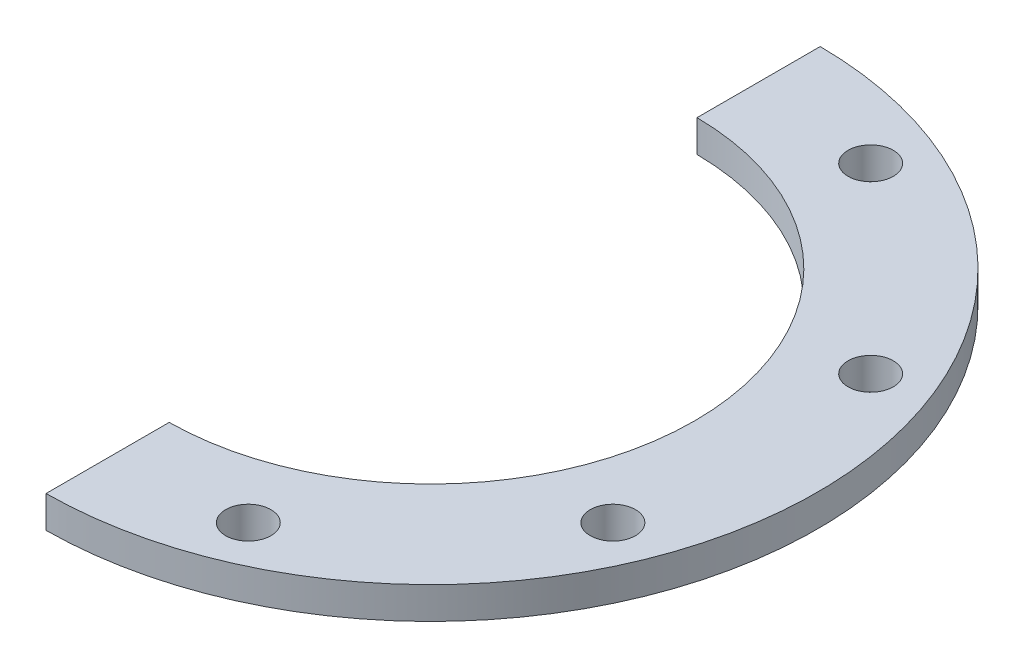
ISO-10303-21;
HEADER;
FILE_DESCRIPTION(('STEP AP214'),'2;1');
FILE_NAME('part.step','',(''),(''),'','','');
FILE_SCHEMA(('AUTOMOTIVE_DESIGN { 1 0 10303 214 1 1 1 1 }'));
ENDSEC;
DATA;
#1=APPLICATION_CONTEXT('core data for automotive mechanical design processes');
#2=APPLICATION_PROTOCOL_DEFINITION('international standard','automotive_design',2000,#1);
#3=PRODUCT_CONTEXT('',#1,'mechanical');
#4=PRODUCT('Part','Part','',(#3));
#5=PRODUCT_RELATED_PRODUCT_CATEGORY('part','',(#4));
#6=PRODUCT_DEFINITION_FORMATION('','',#4);
#7=PRODUCT_DEFINITION_CONTEXT('part definition',#1,'design');
#8=PRODUCT_DEFINITION('design','',#6,#7);
#9=PRODUCT_DEFINITION_SHAPE('','',#8);
#10=(LENGTH_UNIT() NAMED_UNIT(*) SI_UNIT(.MILLI.,.METRE.));
#11=(NAMED_UNIT(*) PLANE_ANGLE_UNIT() SI_UNIT($,.RADIAN.));
#12=(NAMED_UNIT(*) SI_UNIT($,.STERADIAN.) SOLID_ANGLE_UNIT());
#13=UNCERTAINTY_MEASURE_WITH_UNIT(LENGTH_MEASURE(1.E-05),#10,'distance_accuracy_value','');
#14=(GEOMETRIC_REPRESENTATION_CONTEXT(3) GLOBAL_UNCERTAINTY_ASSIGNED_CONTEXT((#13)) GLOBAL_UNIT_ASSIGNED_CONTEXT((#10,
#11,#12)) REPRESENTATION_CONTEXT('',''));
#15=CARTESIAN_POINT('',(0.,0.,0.));
#16=DIRECTION('',(0.,0.,1.));
#17=DIRECTION('',(1.,0.,0.));
#18=AXIS2_PLACEMENT_3D('',#15,#16,#17);
#19=CARTESIAN_POINT('',(0.,84.005,0.));
#20=DIRECTION('',(0.,1.,0.));
#21=DIRECTION('',(0.,0.,1.));
#22=AXIS2_PLACEMENT_3D('',#19,#20,#21);
#23=CYLINDRICAL_SURFACE('',#22,26.25);
#24=CARTESIAN_POINT('',(0.,87.18,0.));
#25=DIRECTION('',(0.,1.,0.));
#26=DIRECTION('',(0.,0.,1.));
#27=AXIS2_PLACEMENT_3D('',#24,#25,#26);
#28=CIRCLE('',#27,26.25);
#29=CARTESIAN_POINT('',(0.250000000000008,87.18,26.2488094968134));
#30=VERTEX_POINT('',#29);
#31=CARTESIAN_POINT('',(0.250000000000008,87.18,-26.2488094968134));
#32=VERTEX_POINT('',#31);
#33=EDGE_CURVE('E110',#30,#32,#28,.T.);
#34=ORIENTED_EDGE('',*,*,#33,.T.);
#35=DIRECTION('',(0.,1.,0.));
#36=VECTOR('',#35,1.);
#37=CARTESIAN_POINT('',(0.250000000000008,84.005,-26.2488094968134));
#38=LINE('',#37,#36);
#39=CARTESIAN_POINT('',(0.250000000000008,84.005,-26.2488094968134));
#40=VERTEX_POINT('',#39);
#41=EDGE_CURVE('E11',#40,#32,#38,.T.);
#42=ORIENTED_EDGE('',*,*,#41,.F.);
#43=CARTESIAN_POINT('',(0.,84.005,0.));
#44=DIRECTION('',(0.,1.,0.));
#45=DIRECTION('',(0.,0.,1.));
#46=AXIS2_PLACEMENT_3D('',#43,#44,#45);
#47=CIRCLE('',#46,26.25);
#48=CARTESIAN_POINT('',(0.250000000000008,84.005,26.2488094968134));
#49=VERTEX_POINT('',#48);
#50=EDGE_CURVE('E53',#49,#40,#47,.T.);
#51=ORIENTED_EDGE('',*,*,#50,.F.);
#52=DIRECTION('',(0.,1.,0.));
#53=VECTOR('',#52,1.);
#54=CARTESIAN_POINT('',(0.250000000000008,84.005,26.2488094968134));
#55=LINE('',#54,#53);
#56=EDGE_CURVE('E38',#49,#30,#55,.T.);
#57=ORIENTED_EDGE('',*,*,#56,.T.);
#58=EDGE_LOOP('',(#34,#42,#51,#57));
#59=FACE_BOUND('',#58,.T.);
#60=ADVANCED_FACE('F35',(#59),#23,.F.);
#61=CARTESIAN_POINT('',(0.250000000000008,84.005,0.));
#62=DIRECTION('',(-1.,0.,0.));
#63=DIRECTION('',(0.,0.,1.));
#64=AXIS2_PLACEMENT_3D('',#61,#62,#63);
#65=PLANE('',#64);
#66=DIRECTION('',(0.,0.,1.));
#67=VECTOR('',#66,1.);
#68=CARTESIAN_POINT('',(0.250000000000008,87.18,0.));
#69=LINE('',#68,#67);
#70=CARTESIAN_POINT('',(0.250000000000008,87.18,-38.4991883031318));
#71=VERTEX_POINT('',#70);
#72=EDGE_CURVE('E115',#71,#32,#69,.T.);
#73=ORIENTED_EDGE('',*,*,#72,.F.);
#74=DIRECTION('',(0.,1.,0.));
#75=VECTOR('',#74,1.);
#76=CARTESIAN_POINT('',(0.250000000000008,84.005,-38.4991883031318));
#77=LINE('',#76,#75);
#78=CARTESIAN_POINT('',(0.250000000000008,84.005,-38.4991883031318));
#79=VERTEX_POINT('',#78);
#80=EDGE_CURVE('E44',#79,#71,#77,.T.);
#81=ORIENTED_EDGE('',*,*,#80,.F.);
#82=DIRECTION('',(0.,0.,1.));
#83=VECTOR('',#82,1.);
#84=CARTESIAN_POINT('',(0.250000000000008,84.005,0.));
#85=LINE('',#84,#83);
#86=EDGE_CURVE('E93',#79,#40,#85,.T.);
#87=ORIENTED_EDGE('',*,*,#86,.T.);
#88=ORIENTED_EDGE('',*,*,#41,.T.);
#89=EDGE_LOOP('',(#73,#81,#87,#88));
#90=FACE_BOUND('',#89,.T.);
#91=ADVANCED_FACE('F146',(#90),#65,.T.);
#92=CARTESIAN_POINT('',(0.,84.005,0.));
#93=DIRECTION('',(0.,1.,0.));
#94=DIRECTION('',(0.,0.,1.));
#95=AXIS2_PLACEMENT_3D('',#92,#93,#94);
#96=CYLINDRICAL_SURFACE('',#95,38.5);
#97=CARTESIAN_POINT('',(0.,87.18,0.));
#98=DIRECTION('',(0.,1.,0.));
#99=DIRECTION('',(0.,0.,1.));
#100=AXIS2_PLACEMENT_3D('',#97,#98,#99);
#101=CIRCLE('',#100,38.5);
#102=CARTESIAN_POINT('',(0.250000000000008,87.18,38.4991883031318));
#103=VERTEX_POINT('',#102);
#104=EDGE_CURVE('E85',#103,#71,#101,.T.);
#105=ORIENTED_EDGE('',*,*,#104,.F.);
#106=DIRECTION('',(0.,1.,0.));
#107=VECTOR('',#106,1.);
#108=CARTESIAN_POINT('',(0.250000000000008,84.005,38.4991883031318));
#109=LINE('',#108,#107);
#110=CARTESIAN_POINT('',(0.250000000000008,84.005,38.4991883031318));
#111=VERTEX_POINT('',#110);
#112=EDGE_CURVE('E82',#111,#103,#109,.T.);
#113=ORIENTED_EDGE('',*,*,#112,.F.);
#114=CARTESIAN_POINT('',(0.,84.005,0.));
#115=DIRECTION('',(0.,1.,0.));
#116=DIRECTION('',(0.,0.,1.));
#117=AXIS2_PLACEMENT_3D('',#114,#115,#116);
#118=CIRCLE('',#117,38.5);
#119=EDGE_CURVE('E84',#111,#79,#118,.T.);
#120=ORIENTED_EDGE('',*,*,#119,.T.);
#121=ORIENTED_EDGE('',*,*,#80,.T.);
#122=EDGE_LOOP('',(#105,#113,#120,#121));
#123=FACE_BOUND('',#122,.T.);
#124=ADVANCED_FACE('F83',(#123),#96,.T.);
#125=CARTESIAN_POINT('',(30.9499643391281,84.005,-12.8198949842307));
#126=DIRECTION('',(0.,1.,0.));
#127=DIRECTION('',(0.,0.,1.));
#128=AXIS2_PLACEMENT_3D('',#125,#126,#127);
#129=CYLINDRICAL_SURFACE('',#128,2.25);
#130=CARTESIAN_POINT('',(30.9499643391281,84.005,-12.8198949842307));
#131=DIRECTION('',(0.,1.,0.));
#132=DIRECTION('',(0.,0.,1.));
#133=AXIS2_PLACEMENT_3D('',#130,#131,#132);
#134=CIRCLE('',#133,2.25);
#135=CARTESIAN_POINT('',(30.9499643391281,84.005,-10.5698949842307));
#136=VERTEX_POINT('',#135);
#137=EDGE_CURVE('E104',#136,#136,#134,.T.);
#138=ORIENTED_EDGE('',*,*,#137,.F.);
#139=EDGE_LOOP('',(#138));
#140=FACE_BOUND('',#139,.T.);
#141=CARTESIAN_POINT('',(30.9499643391281,87.18,-12.8198949842307));
#142=DIRECTION('',(0.,1.,0.));
#143=DIRECTION('',(0.,0.,1.));
#144=AXIS2_PLACEMENT_3D('',#141,#142,#143);
#145=CIRCLE('',#144,2.25);
#146=CARTESIAN_POINT('',(30.9499643391281,87.18,-10.5698949842307));
#147=VERTEX_POINT('',#146);
#148=EDGE_CURVE('E124',#147,#147,#145,.T.);
#149=ORIENTED_EDGE('',*,*,#148,.T.);
#150=EDGE_LOOP('',(#149));
#151=FACE_BOUND('',#150,.T.);
#152=ADVANCED_FACE('F155',(#140,#151),#129,.F.);
#153=CARTESIAN_POINT('',(30.9499643391282,84.005,12.8198949842303));
#154=DIRECTION('',(0.,1.,0.));
#155=DIRECTION('',(0.,0.,1.));
#156=AXIS2_PLACEMENT_3D('',#153,#154,#155);
#157=CYLINDRICAL_SURFACE('',#156,2.25);
#158=CARTESIAN_POINT('',(30.9499643391282,84.005,12.8198949842303));
#159=DIRECTION('',(0.,1.,0.));
#160=DIRECTION('',(0.,0.,1.));
#161=AXIS2_PLACEMENT_3D('',#158,#159,#160);
#162=CIRCLE('',#161,2.25);
#163=CARTESIAN_POINT('',(30.9499643391282,84.005,15.0698949842303));
#164=VERTEX_POINT('',#163);
#165=EDGE_CURVE('E101',#164,#164,#162,.T.);
#166=ORIENTED_EDGE('',*,*,#165,.F.);
#167=EDGE_LOOP('',(#166));
#168=FACE_BOUND('',#167,.T.);
#169=CARTESIAN_POINT('',(30.9499643391282,87.18,12.8198949842303));
#170=DIRECTION('',(0.,1.,0.));
#171=DIRECTION('',(0.,0.,1.));
#172=AXIS2_PLACEMENT_3D('',#169,#170,#171);
#173=CIRCLE('',#172,2.25);
#174=CARTESIAN_POINT('',(30.9499643391282,87.18,15.0698949842303));
#175=VERTEX_POINT('',#174);
#176=EDGE_CURVE('E121',#175,#175,#173,.T.);
#177=ORIENTED_EDGE('',*,*,#176,.T.);
#178=EDGE_LOOP('',(#177));
#179=FACE_BOUND('',#178,.T.);
#180=ADVANCED_FACE('F166',(#168,#179),#157,.F.);
#181=CARTESIAN_POINT('',(12.8198949842307,84.005,30.949964339128));
#182=DIRECTION('',(0.,1.,0.));
#183=DIRECTION('',(0.,0.,1.));
#184=AXIS2_PLACEMENT_3D('',#181,#182,#183);
#185=CYLINDRICAL_SURFACE('',#184,2.25);
#186=CARTESIAN_POINT('',(12.8198949842307,84.005,30.949964339128));
#187=DIRECTION('',(0.,1.,0.));
#188=DIRECTION('',(0.,0.,1.));
#189=AXIS2_PLACEMENT_3D('',#186,#187,#188);
#190=CIRCLE('',#189,2.25);
#191=CARTESIAN_POINT('',(12.8198949842307,84.005,33.199964339128));
#192=VERTEX_POINT('',#191);
#193=EDGE_CURVE('E95',#192,#192,#190,.T.);
#194=ORIENTED_EDGE('',*,*,#193,.F.);
#195=EDGE_LOOP('',(#194));
#196=FACE_BOUND('',#195,.T.);
#197=CARTESIAN_POINT('',(12.8198949842307,87.18,30.949964339128));
#198=DIRECTION('',(0.,1.,0.));
#199=DIRECTION('',(0.,0.,1.));
#200=AXIS2_PLACEMENT_3D('',#197,#198,#199);
#201=CIRCLE('',#200,2.25);
#202=CARTESIAN_POINT('',(12.8198949842307,87.18,33.199964339128));
#203=VERTEX_POINT('',#202);
#204=EDGE_CURVE('E118',#203,#203,#201,.T.);
#205=ORIENTED_EDGE('',*,*,#204,.T.);
#206=EDGE_LOOP('',(#205));
#207=FACE_BOUND('',#206,.T.);
#208=ADVANCED_FACE('F158',(#196,#207),#185,.F.);
#209=CARTESIAN_POINT('',(0.250000000000008,84.005,0.));
#210=DIRECTION('',(1.,0.,0.));
#211=DIRECTION('',(0.,0.,-1.));
#212=AXIS2_PLACEMENT_3D('',#209,#210,#211);
#213=PLANE('',#212);
#214=DIRECTION('',(0.,0.,-1.));
#215=VECTOR('',#214,1.);
#216=CARTESIAN_POINT('',(0.250000000000008,87.18,0.));
#217=LINE('',#216,#215);
#218=EDGE_CURVE('E112',#103,#30,#217,.T.);
#219=ORIENTED_EDGE('',*,*,#218,.T.);
#220=ORIENTED_EDGE('',*,*,#56,.F.);
#221=DIRECTION('',(0.,0.,-1.));
#222=VECTOR('',#221,1.);
#223=CARTESIAN_POINT('',(0.250000000000008,84.005,0.));
#224=LINE('',#223,#222);
#225=EDGE_CURVE('E79',#111,#49,#224,.T.);
#226=ORIENTED_EDGE('',*,*,#225,.F.);
#227=ORIENTED_EDGE('',*,*,#112,.T.);
#228=EDGE_LOOP('',(#219,#220,#226,#227));
#229=FACE_BOUND('',#228,.T.);
#230=ADVANCED_FACE('F88',(#229),#213,.F.);
#231=CARTESIAN_POINT('',(12.8198949842303,84.005,-30.9499643391282));
#232=DIRECTION('',(0.,1.,0.));
#233=DIRECTION('',(0.,0.,1.));
#234=AXIS2_PLACEMENT_3D('',#231,#232,#233);
#235=CYLINDRICAL_SURFACE('',#234,2.25);
#236=CARTESIAN_POINT('',(12.8198949842303,84.005,-30.9499643391282));
#237=DIRECTION('',(0.,1.,0.));
#238=DIRECTION('',(0.,0.,1.));
#239=AXIS2_PLACEMENT_3D('',#236,#237,#238);
#240=CIRCLE('',#239,2.25);
#241=CARTESIAN_POINT('',(12.8198949842303,84.005,-28.6999643391282));
#242=VERTEX_POINT('',#241);
#243=EDGE_CURVE('E107',#242,#242,#240,.T.);
#244=ORIENTED_EDGE('',*,*,#243,.F.);
#245=EDGE_LOOP('',(#244));
#246=FACE_BOUND('',#245,.T.);
#247=CARTESIAN_POINT('',(12.8198949842303,87.18,-30.9499643391282));
#248=DIRECTION('',(0.,1.,0.));
#249=DIRECTION('',(0.,0.,1.));
#250=AXIS2_PLACEMENT_3D('',#247,#248,#249);
#251=CIRCLE('',#250,2.25);
#252=CARTESIAN_POINT('',(12.8198949842303,87.18,-28.6999643391282));
#253=VERTEX_POINT('',#252);
#254=EDGE_CURVE('E127',#253,#253,#251,.T.);
#255=ORIENTED_EDGE('',*,*,#254,.T.);
#256=EDGE_LOOP('',(#255));
#257=FACE_BOUND('',#256,.T.);
#258=ADVANCED_FACE('F132',(#246,#257),#235,.F.);
#259=CARTESIAN_POINT('',(0.,84.005,0.));
#260=DIRECTION('',(0.,1.,0.));
#261=DIRECTION('',(0.,0.,1.));
#262=AXIS2_PLACEMENT_3D('',#259,#260,#261);
#263=PLANE('',#262);
#264=ORIENTED_EDGE('',*,*,#50,.T.);
#265=ORIENTED_EDGE('',*,*,#86,.F.);
#266=ORIENTED_EDGE('',*,*,#119,.F.);
#267=ORIENTED_EDGE('',*,*,#225,.T.);
#268=EDGE_LOOP('',(#264,#265,#266,#267));
#269=FACE_BOUND('',#268,.T.);
#270=ORIENTED_EDGE('',*,*,#193,.T.);
#271=EDGE_LOOP('',(#270));
#272=FACE_BOUND('',#271,.T.);
#273=ORIENTED_EDGE('',*,*,#165,.T.);
#274=EDGE_LOOP('',(#273));
#275=FACE_BOUND('',#274,.T.);
#276=ORIENTED_EDGE('',*,*,#137,.T.);
#277=EDGE_LOOP('',(#276));
#278=FACE_BOUND('',#277,.T.);
#279=ORIENTED_EDGE('',*,*,#243,.T.);
#280=EDGE_LOOP('',(#279));
#281=FACE_BOUND('',#280,.T.);
#282=ADVANCED_FACE('F91',(#269,#272,#275,#278,#281),#263,.F.);
#283=CARTESIAN_POINT('',(0.,87.18,0.));
#284=DIRECTION('',(0.,1.,0.));
#285=DIRECTION('',(0.,0.,1.));
#286=AXIS2_PLACEMENT_3D('',#283,#284,#285);
#287=PLANE('',#286);
#288=ORIENTED_EDGE('',*,*,#33,.F.);
#289=ORIENTED_EDGE('',*,*,#218,.F.);
#290=ORIENTED_EDGE('',*,*,#104,.T.);
#291=ORIENTED_EDGE('',*,*,#72,.T.);
#292=EDGE_LOOP('',(#288,#289,#290,#291));
#293=FACE_BOUND('',#292,.T.);
#294=ORIENTED_EDGE('',*,*,#204,.F.);
#295=EDGE_LOOP('',(#294));
#296=FACE_BOUND('',#295,.T.);
#297=ORIENTED_EDGE('',*,*,#176,.F.);
#298=EDGE_LOOP('',(#297));
#299=FACE_BOUND('',#298,.T.);
#300=ORIENTED_EDGE('',*,*,#148,.F.);
#301=EDGE_LOOP('',(#300));
#302=FACE_BOUND('',#301,.T.);
#303=ORIENTED_EDGE('',*,*,#254,.F.);
#304=EDGE_LOOP('',(#303));
#305=FACE_BOUND('',#304,.T.);
#306=ADVANCED_FACE('F134',(#293,#296,#299,#302,#305),#287,.T.);
#307=CLOSED_SHELL('',(#60,#91,#124,#152,#180,#208,#230,#258,#282,#306));
#308=MANIFOLD_SOLID_BREP('B2',#307);
#309=ADVANCED_BREP_SHAPE_REPRESENTATION('',(#18,#308),#14);
#310=SHAPE_DEFINITION_REPRESENTATION(#9,#309);
ENDSEC;
END-ISO-10303-21;
